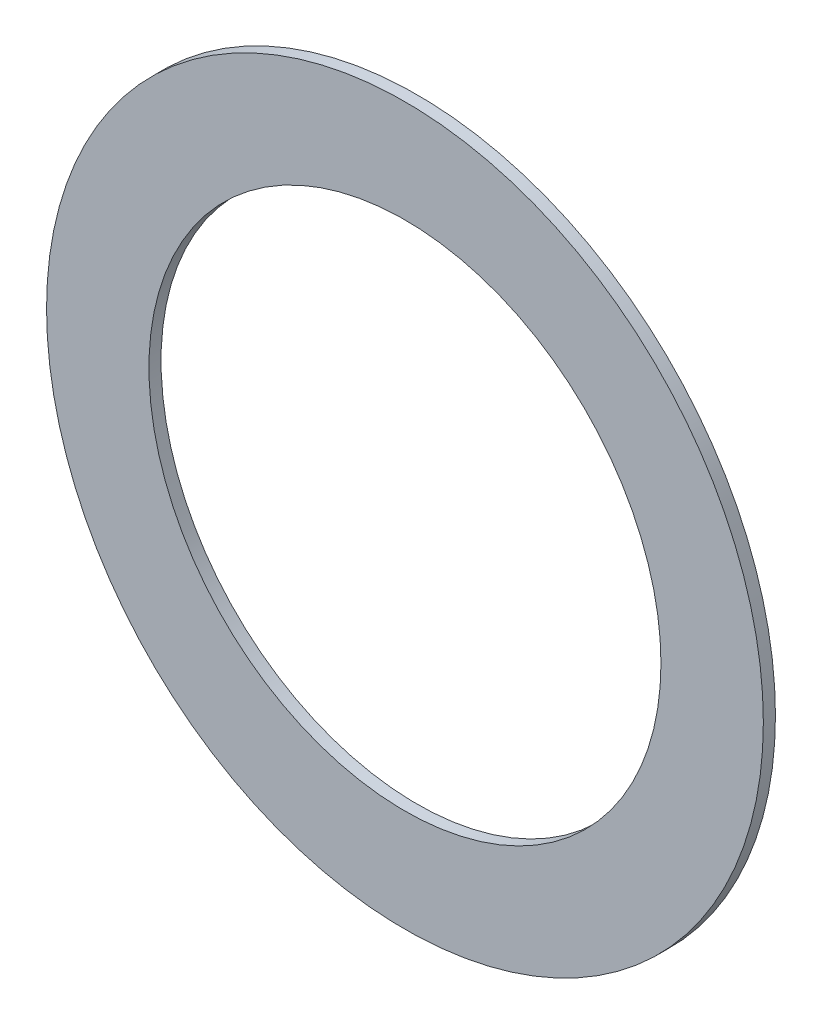
ISO-10303-21;
HEADER;
FILE_DESCRIPTION(('STEP AP214'),'2;1');
FILE_NAME('part.step','',(''),(''),'','','');
FILE_SCHEMA(('AUTOMOTIVE_DESIGN { 1 0 10303 214 1 1 1 1 }'));
ENDSEC;
DATA;
#1=APPLICATION_CONTEXT('core data for automotive mechanical design processes');
#2=APPLICATION_PROTOCOL_DEFINITION('international standard','automotive_design',2000,#1);
#3=PRODUCT_CONTEXT('',#1,'mechanical');
#4=PRODUCT('Part','Part','',(#3));
#5=PRODUCT_RELATED_PRODUCT_CATEGORY('part','',(#4));
#6=PRODUCT_DEFINITION_FORMATION('','',#4);
#7=PRODUCT_DEFINITION_CONTEXT('part definition',#1,'design');
#8=PRODUCT_DEFINITION('design','',#6,#7);
#9=PRODUCT_DEFINITION_SHAPE('','',#8);
#10=(LENGTH_UNIT() NAMED_UNIT(*) SI_UNIT(.MILLI.,.METRE.));
#11=(NAMED_UNIT(*) PLANE_ANGLE_UNIT() SI_UNIT($,.RADIAN.));
#12=(NAMED_UNIT(*) SI_UNIT($,.STERADIAN.) SOLID_ANGLE_UNIT());
#13=UNCERTAINTY_MEASURE_WITH_UNIT(LENGTH_MEASURE(1.E-05),#10,'distance_accuracy_value','');
#14=(GEOMETRIC_REPRESENTATION_CONTEXT(3) GLOBAL_UNCERTAINTY_ASSIGNED_CONTEXT((#13)) GLOBAL_UNIT_ASSIGNED_CONTEXT((#10,
#11,#12)) REPRESENTATION_CONTEXT('',''));
#15=CARTESIAN_POINT('',(0.,0.,0.));
#16=DIRECTION('',(0.,0.,1.));
#17=DIRECTION('',(1.,0.,0.));
#18=AXIS2_PLACEMENT_3D('',#15,#16,#17);
#19=CARTESIAN_POINT('',(0.,0.,3.));
#20=DIRECTION('',(0.,0.,1.));
#21=DIRECTION('',(1.,0.,0.));
#22=AXIS2_PLACEMENT_3D('',#19,#20,#21);
#23=PLANE('',#22);
#24=CARTESIAN_POINT('',(0.,0.,3.));
#25=DIRECTION('',(0.,0.,1.));
#26=DIRECTION('',(1.,0.,0.));
#27=AXIS2_PLACEMENT_3D('',#24,#25,#26);
#28=CIRCLE('',#27,88.9);
#29=CARTESIAN_POINT('',(88.9,0.,3.));
#30=VERTEX_POINT('',#29);
#31=EDGE_CURVE('E10',#30,#30,#28,.T.);
#32=ORIENTED_EDGE('',*,*,#31,.T.);
#33=EDGE_LOOP('',(#32));
#34=FACE_BOUND('',#33,.T.);
#35=CARTESIAN_POINT('',(0.,0.,3.));
#36=DIRECTION('',(0.,0.,1.));
#37=DIRECTION('',(1.,0.,0.));
#38=AXIS2_PLACEMENT_3D('',#35,#36,#37);
#39=CIRCLE('',#38,63.5);
#40=CARTESIAN_POINT('',(63.5,0.,3.));
#41=VERTEX_POINT('',#40);
#42=EDGE_CURVE('E60',#41,#41,#39,.T.);
#43=ORIENTED_EDGE('',*,*,#42,.F.);
#44=EDGE_LOOP('',(#43));
#45=FACE_BOUND('',#44,.T.);
#46=ADVANCED_FACE('F47',(#34,#45),#23,.T.);
#47=CARTESIAN_POINT('',(0.,0.,0.));
#48=DIRECTION('',(0.,0.,1.));
#49=DIRECTION('',(1.,0.,0.));
#50=AXIS2_PLACEMENT_3D('',#47,#48,#49);
#51=PLANE('',#50);
#52=CARTESIAN_POINT('',(0.,0.,0.));
#53=DIRECTION('',(0.,0.,1.));
#54=DIRECTION('',(1.,0.,0.));
#55=AXIS2_PLACEMENT_3D('',#52,#53,#54);
#56=CIRCLE('',#55,88.9);
#57=CARTESIAN_POINT('',(88.9,0.,0.));
#58=VERTEX_POINT('',#57);
#59=EDGE_CURVE('E51',#58,#58,#56,.T.);
#60=ORIENTED_EDGE('',*,*,#59,.F.);
#61=EDGE_LOOP('',(#60));
#62=FACE_BOUND('',#61,.T.);
#63=CARTESIAN_POINT('',(0.,0.,0.));
#64=DIRECTION('',(0.,0.,1.));
#65=DIRECTION('',(1.,0.,0.));
#66=AXIS2_PLACEMENT_3D('',#63,#64,#65);
#67=CIRCLE('',#66,63.5);
#68=CARTESIAN_POINT('',(63.5,0.,0.));
#69=VERTEX_POINT('',#68);
#70=EDGE_CURVE('E62',#69,#69,#67,.T.);
#71=ORIENTED_EDGE('',*,*,#70,.T.);
#72=EDGE_LOOP('',(#71));
#73=FACE_BOUND('',#72,.T.);
#74=ADVANCED_FACE('F74',(#62,#73),#51,.F.);
#75=CARTESIAN_POINT('',(0.,0.,3.));
#76=DIRECTION('',(0.,0.,-1.));
#77=DIRECTION('',(-1.,0.,0.));
#78=AXIS2_PLACEMENT_3D('',#75,#76,#77);
#79=CYLINDRICAL_SURFACE('',#78,88.9);
#80=ORIENTED_EDGE('',*,*,#31,.F.);
#81=EDGE_LOOP('',(#80));
#82=FACE_BOUND('',#81,.T.);
#83=ORIENTED_EDGE('',*,*,#59,.T.);
#84=EDGE_LOOP('',(#83));
#85=FACE_BOUND('',#84,.T.);
#86=ADVANCED_FACE('F49',(#82,#85),#79,.T.);
#87=CARTESIAN_POINT('',(0.,0.,3.));
#88=DIRECTION('',(0.,0.,-1.));
#89=DIRECTION('',(-1.,0.,0.));
#90=AXIS2_PLACEMENT_3D('',#87,#88,#89);
#91=CYLINDRICAL_SURFACE('',#90,63.5);
#92=ORIENTED_EDGE('',*,*,#42,.T.);
#93=EDGE_LOOP('',(#92));
#94=FACE_BOUND('',#93,.T.);
#95=ORIENTED_EDGE('',*,*,#70,.F.);
#96=EDGE_LOOP('',(#95));
#97=FACE_BOUND('',#96,.T.);
#98=ADVANCED_FACE('F70',(#94,#97),#91,.F.);
#99=CLOSED_SHELL('',(#46,#74,#86,#98));
#100=MANIFOLD_SOLID_BREP('B2',#99);
#101=ADVANCED_BREP_SHAPE_REPRESENTATION('',(#18,#100),#14);
#102=SHAPE_DEFINITION_REPRESENTATION(#9,#101);
ENDSEC;
END-ISO-10303-21;
